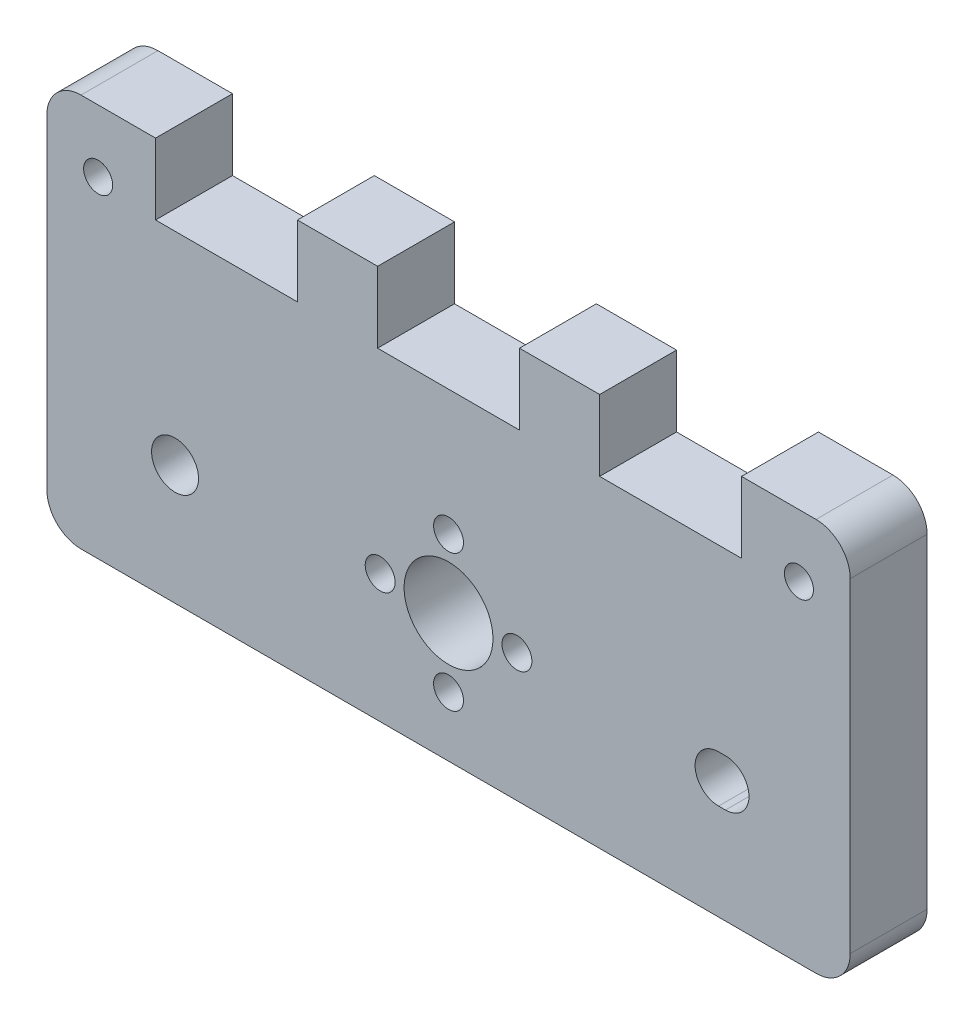
ISO-10303-21;
HEADER;
FILE_DESCRIPTION(('STEP AP214'),'2;1');
FILE_NAME('part.step','',(''),(''),'','','');
FILE_SCHEMA(('AUTOMOTIVE_DESIGN { 1 0 10303 214 1 1 1 1 }'));
ENDSEC;
DATA;
#1=APPLICATION_CONTEXT('core data for automotive mechanical design processes');
#2=APPLICATION_PROTOCOL_DEFINITION('international standard','automotive_design',2000,#1);
#3=PRODUCT_CONTEXT('',#1,'mechanical');
#4=PRODUCT('Part','Part','',(#3));
#5=PRODUCT_RELATED_PRODUCT_CATEGORY('part','',(#4));
#6=PRODUCT_DEFINITION_FORMATION('','',#4);
#7=PRODUCT_DEFINITION_CONTEXT('part definition',#1,'design');
#8=PRODUCT_DEFINITION('design','',#6,#7);
#9=PRODUCT_DEFINITION_SHAPE('','',#8);
#10=(LENGTH_UNIT() NAMED_UNIT(*) SI_UNIT(.MILLI.,.METRE.));
#11=(NAMED_UNIT(*) PLANE_ANGLE_UNIT() SI_UNIT($,.RADIAN.));
#12=(NAMED_UNIT(*) SI_UNIT($,.STERADIAN.) SOLID_ANGLE_UNIT());
#13=UNCERTAINTY_MEASURE_WITH_UNIT(LENGTH_MEASURE(1.E-05),#10,'distance_accuracy_value','');
#14=(GEOMETRIC_REPRESENTATION_CONTEXT(3) GLOBAL_UNCERTAINTY_ASSIGNED_CONTEXT((#13)) GLOBAL_UNIT_ASSIGNED_CONTEXT((#10,
#11,#12)) REPRESENTATION_CONTEXT('',''));
#15=CARTESIAN_POINT('',(0.,0.,0.));
#16=DIRECTION('',(0.,0.,1.));
#17=DIRECTION('',(1.,0.,0.));
#18=AXIS2_PLACEMENT_3D('',#15,#16,#17);
#19=CARTESIAN_POINT('',(-43.,-93.,9.));
#20=DIRECTION('',(0.,0.,1.));
#21=DIRECTION('',(1.,0.,0.));
#22=AXIS2_PLACEMENT_3D('',#19,#20,#21);
#23=PLANE('',#22);
#24=CARTESIAN_POINT('',(8.,-82.,9.));
#25=DIRECTION('',(0.,0.,1.));
#26=DIRECTION('',(1.,0.,0.));
#27=AXIS2_PLACEMENT_3D('',#24,#25,#26);
#28=CIRCLE('',#27,1.75);
#29=CARTESIAN_POINT('',(9.75,-82.,9.));
#30=VERTEX_POINT('',#29);
#31=EDGE_CURVE('E383',#30,#30,#28,.T.);
#32=ORIENTED_EDGE('',*,*,#31,.F.);
#33=EDGE_LOOP('',(#32));
#34=FACE_BOUND('',#33,.T.);
#35=CARTESIAN_POINT('',(-8.,-82.0000000000004,9.));
#36=DIRECTION('',(0.,0.,1.));
#37=DIRECTION('',(1.,0.,0.));
#38=AXIS2_PLACEMENT_3D('',#35,#36,#37);
#39=CIRCLE('',#38,1.75028583979217);
#40=CARTESIAN_POINT('',(-6.24971416020783,-82.0000000000004,9.));
#41=VERTEX_POINT('',#40);
#42=EDGE_CURVE('E782',#41,#41,#39,.T.);
#43=ORIENTED_EDGE('',*,*,#42,.F.);
#44=EDGE_LOOP('',(#43));
#45=FACE_BOUND('',#44,.T.);
#46=CARTESIAN_POINT('',(-2.27373675443232E-13,-74.0000000000002,9.));
#47=DIRECTION('',(0.,0.,1.));
#48=DIRECTION('',(1.,0.,0.));
#49=AXIS2_PLACEMENT_3D('',#46,#47,#48);
#50=CIRCLE('',#49,1.75000000000036);
#51=CARTESIAN_POINT('',(1.75000000000014,-74.0000000000002,9.));
#52=VERTEX_POINT('',#51);
#53=EDGE_CURVE('E781',#52,#52,#50,.T.);
#54=ORIENTED_EDGE('',*,*,#53,.F.);
#55=EDGE_LOOP('',(#54));
#56=FACE_BOUND('',#55,.T.);
#57=CARTESIAN_POINT('',(2.26393958003914E-13,-90.0000000000002,9.));
#58=DIRECTION('',(0.,0.,1.));
#59=DIRECTION('',(1.,0.,0.));
#60=AXIS2_PLACEMENT_3D('',#57,#58,#59);
#61=CIRCLE('',#60,1.75000000000017);
#62=CARTESIAN_POINT('',(1.75000000000039,-90.0000000000002,9.));
#63=VERTEX_POINT('',#62);
#64=EDGE_CURVE('E399',#63,#63,#61,.T.);
#65=ORIENTED_EDGE('',*,*,#64,.F.);
#66=EDGE_LOOP('',(#65));
#67=FACE_BOUND('',#66,.T.);
#68=CARTESIAN_POINT('',(0.,-82.,9.));
#69=DIRECTION('',(0.,0.,1.));
#70=DIRECTION('',(1.,0.,0.));
#71=AXIS2_PLACEMENT_3D('',#68,#69,#70);
#72=CIRCLE('',#71,5.2);
#73=CARTESIAN_POINT('',(5.2,-82.,9.));
#74=VERTEX_POINT('',#73);
#75=EDGE_CURVE('E379',#74,#74,#72,.T.);
#76=ORIENTED_EDGE('',*,*,#75,.F.);
#77=EDGE_LOOP('',(#76));
#78=FACE_BOUND('',#77,.T.);
#79=CARTESIAN_POINT('',(-41.,-58.3,9.));
#80=DIRECTION('',(0.,0.,1.));
#81=DIRECTION('',(1.,0.,0.));
#82=AXIS2_PLACEMENT_3D('',#79,#80,#81);
#83=CIRCLE('',#82,1.7);
#84=CARTESIAN_POINT('',(-39.3,-58.3,9.));
#85=VERTEX_POINT('',#84);
#86=EDGE_CURVE('E380',#85,#85,#83,.F.);
#87=ORIENTED_EDGE('',*,*,#86,.T.);
#88=EDGE_LOOP('',(#87));
#89=FACE_BOUND('',#88,.T.);
#90=CARTESIAN_POINT('',(41.,-58.3,9.));
#91=DIRECTION('',(0.,0.,1.));
#92=DIRECTION('',(1.,0.,0.));
#93=AXIS2_PLACEMENT_3D('',#90,#91,#92);
#94=CIRCLE('',#93,1.7);
#95=CARTESIAN_POINT('',(42.7,-58.3,9.));
#96=VERTEX_POINT('',#95);
#97=EDGE_CURVE('E375',#96,#96,#94,.F.);
#98=ORIENTED_EDGE('',*,*,#97,.T.);
#99=EDGE_LOOP('',(#98));
#100=FACE_BOUND('',#99,.T.);
#101=DIRECTION('',(-1.,0.,0.));
#102=VECTOR('',#101,1.);
#103=CARTESIAN_POINT('',(-43.,-85.75,9.));
#104=LINE('',#103,#102);
#105=CARTESIAN_POINT('',(32.4,-85.75,9.));
#106=VERTEX_POINT('',#105);
#107=CARTESIAN_POINT('',(31.6,-85.75,9.));
#108=VERTEX_POINT('',#107);
#109=EDGE_CURVE('E269',#106,#108,#104,.T.);
#110=ORIENTED_EDGE('',*,*,#109,.T.);
#111=CARTESIAN_POINT('',(31.6,-83.,9.));
#112=DIRECTION('',(0.,0.,1.));
#113=DIRECTION('',(1.,0.,0.));
#114=AXIS2_PLACEMENT_3D('',#111,#112,#113);
#115=CIRCLE('',#114,2.75);
#116=CARTESIAN_POINT('',(31.6,-80.25,9.));
#117=VERTEX_POINT('',#116);
#118=EDGE_CURVE('E271',#108,#117,#115,.F.);
#119=ORIENTED_EDGE('',*,*,#118,.T.);
#120=DIRECTION('',(1.,0.,0.));
#121=VECTOR('',#120,1.);
#122=CARTESIAN_POINT('',(-43.,-80.25,9.));
#123=LINE('',#122,#121);
#124=CARTESIAN_POINT('',(32.4,-80.25,9.));
#125=VERTEX_POINT('',#124);
#126=EDGE_CURVE('E261',#117,#125,#123,.T.);
#127=ORIENTED_EDGE('',*,*,#126,.T.);
#128=CARTESIAN_POINT('',(32.4,-83.,9.));
#129=DIRECTION('',(0.,0.,1.));
#130=DIRECTION('',(1.,0.,0.));
#131=AXIS2_PLACEMENT_3D('',#128,#129,#130);
#132=CIRCLE('',#131,2.75);
#133=EDGE_CURVE('E270',#125,#106,#132,.F.);
#134=ORIENTED_EDGE('',*,*,#133,.T.);
#135=EDGE_LOOP('',(#110,#119,#127,#134));
#136=FACE_BOUND('',#135,.T.);
#137=CARTESIAN_POINT('',(-32.,-83.,9.));
#138=DIRECTION('',(0.,0.,1.));
#139=DIRECTION('',(1.,0.,0.));
#140=AXIS2_PLACEMENT_3D('',#137,#138,#139);
#141=CIRCLE('',#140,2.75);
#142=CARTESIAN_POINT('',(-29.25,-83.,9.));
#143=VERTEX_POINT('',#142);
#144=EDGE_CURVE('E276',#143,#143,#141,.F.);
#145=ORIENTED_EDGE('',*,*,#144,.T.);
#146=EDGE_LOOP('',(#145));
#147=FACE_BOUND('',#146,.T.);
#148=DIRECTION('',(-1.,0.,0.));
#149=VECTOR('',#148,1.);
#150=CARTESIAN_POINT('',(-43.,-59.3,9.));
#151=LINE('',#150,#149);
#152=CARTESIAN_POINT('',(-17.6807621135332,-59.3,9.));
#153=VERTEX_POINT('',#152);
#154=CARTESIAN_POINT('',(-34.2807621135332,-59.3,9.));
#155=VERTEX_POINT('',#154);
#156=EDGE_CURVE('E252',#153,#155,#151,.T.);
#157=ORIENTED_EDGE('',*,*,#156,.T.);
#158=DIRECTION('',(0.,1.,0.));
#159=VECTOR('',#158,1.);
#160=CARTESIAN_POINT('',(-34.2807621135332,-93.,9.));
#161=LINE('',#160,#159);
#162=CARTESIAN_POINT('',(-34.2807621135332,-51.,9.));
#163=VERTEX_POINT('',#162);
#164=EDGE_CURVE('E215',#155,#163,#161,.T.);
#165=ORIENTED_EDGE('',*,*,#164,.T.);
#166=DIRECTION('',(-1.,0.,0.));
#167=VECTOR('',#166,1.);
#168=CARTESIAN_POINT('',(43.,-51.,9.));
#169=LINE('',#168,#167);
#170=CARTESIAN_POINT('',(-43.,-51.,9.));
#171=VERTEX_POINT('',#170);
#172=EDGE_CURVE('E291',#163,#171,#169,.T.);
#173=ORIENTED_EDGE('',*,*,#172,.T.);
#174=CARTESIAN_POINT('',(-43.,-55.,9.));
#175=DIRECTION('',(0.,0.,1.));
#176=DIRECTION('',(1.,0.,0.));
#177=AXIS2_PLACEMENT_3D('',#174,#175,#176);
#178=CIRCLE('',#177,3.99999999999999);
#179=CARTESIAN_POINT('',(-47.,-55.,9.));
#180=VERTEX_POINT('',#179);
#181=EDGE_CURVE('E300',#171,#180,#178,.T.);
#182=ORIENTED_EDGE('',*,*,#181,.T.);
#183=DIRECTION('',(0.,-1.,0.));
#184=VECTOR('',#183,1.);
#185=CARTESIAN_POINT('',(-47.,-55.,9.));
#186=LINE('',#185,#184);
#187=CARTESIAN_POINT('',(-47.,-93.,9.));
#188=VERTEX_POINT('',#187);
#189=EDGE_CURVE('E299',#180,#188,#186,.T.);
#190=ORIENTED_EDGE('',*,*,#189,.T.);
#191=CARTESIAN_POINT('',(-43.,-93.,9.));
#192=DIRECTION('',(0.,0.,1.));
#193=DIRECTION('',(1.,0.,0.));
#194=AXIS2_PLACEMENT_3D('',#191,#192,#193);
#195=CIRCLE('',#194,3.99999999999999);
#196=CARTESIAN_POINT('',(-43.,-97.,9.));
#197=VERTEX_POINT('',#196);
#198=EDGE_CURVE('E282',#188,#197,#195,.T.);
#199=ORIENTED_EDGE('',*,*,#198,.T.);
#200=DIRECTION('',(1.,0.,0.));
#201=VECTOR('',#200,1.);
#202=CARTESIAN_POINT('',(-43.,-97.,9.));
#203=LINE('',#202,#201);
#204=CARTESIAN_POINT('',(43.,-97.,9.));
#205=VERTEX_POINT('',#204);
#206=EDGE_CURVE('E281',#197,#205,#203,.T.);
#207=ORIENTED_EDGE('',*,*,#206,.T.);
#208=CARTESIAN_POINT('',(43.,-93.,9.));
#209=DIRECTION('',(0.,0.,1.));
#210=DIRECTION('',(1.,0.,0.));
#211=AXIS2_PLACEMENT_3D('',#208,#209,#210);
#212=CIRCLE('',#211,3.99999999999999);
#213=CARTESIAN_POINT('',(47.,-93.,9.));
#214=VERTEX_POINT('',#213);
#215=EDGE_CURVE('E290',#205,#214,#212,.T.);
#216=ORIENTED_EDGE('',*,*,#215,.T.);
#217=DIRECTION('',(0.,1.,0.));
#218=VECTOR('',#217,1.);
#219=CARTESIAN_POINT('',(47.,-93.,9.));
#220=LINE('',#219,#218);
#221=CARTESIAN_POINT('',(47.,-55.,9.));
#222=VERTEX_POINT('',#221);
#223=EDGE_CURVE('E287',#214,#222,#220,.T.);
#224=ORIENTED_EDGE('',*,*,#223,.T.);
#225=CARTESIAN_POINT('',(43.,-55.,9.));
#226=DIRECTION('',(0.,0.,1.));
#227=DIRECTION('',(1.,0.,0.));
#228=AXIS2_PLACEMENT_3D('',#225,#226,#227);
#229=CIRCLE('',#228,3.99999999999999);
#230=CARTESIAN_POINT('',(43.,-51.,9.));
#231=VERTEX_POINT('',#230);
#232=EDGE_CURVE('E293',#222,#231,#229,.T.);
#233=ORIENTED_EDGE('',*,*,#232,.T.);
#234=CARTESIAN_POINT('',(34.2807621135332,-51.,9.));
#235=VERTEX_POINT('',#234);
#236=EDGE_CURVE('E295',#231,#235,#169,.T.);
#237=ORIENTED_EDGE('',*,*,#236,.T.);
#238=DIRECTION('',(0.,-1.,0.));
#239=VECTOR('',#238,1.);
#240=CARTESIAN_POINT('',(34.2807621135332,-93.,9.));
#241=LINE('',#240,#239);
#242=CARTESIAN_POINT('',(34.2807621135332,-59.3,9.));
#243=VERTEX_POINT('',#242);
#244=EDGE_CURVE('E232',#235,#243,#241,.T.);
#245=ORIENTED_EDGE('',*,*,#244,.T.);
#246=DIRECTION('',(-1.,0.,0.));
#247=VECTOR('',#246,1.);
#248=CARTESIAN_POINT('',(-43.,-59.3,9.));
#249=LINE('',#248,#247);
#250=CARTESIAN_POINT('',(17.6807621135332,-59.3,9.));
#251=VERTEX_POINT('',#250);
#252=EDGE_CURVE('E211',#243,#251,#249,.T.);
#253=ORIENTED_EDGE('',*,*,#252,.T.);
#254=DIRECTION('',(0.,1.,0.));
#255=VECTOR('',#254,1.);
#256=CARTESIAN_POINT('',(17.6807621135332,-93.,9.));
#257=LINE('',#256,#255);
#258=CARTESIAN_POINT('',(17.6807621135332,-51.,9.));
#259=VERTEX_POINT('',#258);
#260=EDGE_CURVE('E239',#251,#259,#257,.T.);
#261=ORIENTED_EDGE('',*,*,#260,.T.);
#262=CARTESIAN_POINT('',(8.3,-51.,9.));
#263=VERTEX_POINT('',#262);
#264=EDGE_CURVE('E222',#259,#263,#169,.T.);
#265=ORIENTED_EDGE('',*,*,#264,.T.);
#266=DIRECTION('',(0.,-1.,0.));
#267=VECTOR('',#266,1.);
#268=CARTESIAN_POINT('',(8.3,-93.,9.));
#269=LINE('',#268,#267);
#270=CARTESIAN_POINT('',(8.29999999999999,-59.3,9.));
#271=VERTEX_POINT('',#270);
#272=EDGE_CURVE('E63',#263,#271,#269,.T.);
#273=ORIENTED_EDGE('',*,*,#272,.T.);
#274=DIRECTION('',(-1.,0.,0.));
#275=VECTOR('',#274,1.);
#276=CARTESIAN_POINT('',(-43.,-59.3,9.));
#277=LINE('',#276,#275);
#278=CARTESIAN_POINT('',(-8.30000000000001,-59.3,9.));
#279=VERTEX_POINT('',#278);
#280=EDGE_CURVE('E202',#271,#279,#277,.T.);
#281=ORIENTED_EDGE('',*,*,#280,.T.);
#282=DIRECTION('',(0.,1.,0.));
#283=VECTOR('',#282,1.);
#284=CARTESIAN_POINT('',(-8.30000000000001,-93.,9.));
#285=LINE('',#284,#283);
#286=CARTESIAN_POINT('',(-8.30000000000001,-51.,9.));
#287=VERTEX_POINT('',#286);
#288=EDGE_CURVE('E227',#279,#287,#285,.T.);
#289=ORIENTED_EDGE('',*,*,#288,.T.);
#290=CARTESIAN_POINT('',(-17.6807621135332,-51.,9.));
#291=VERTEX_POINT('',#290);
#292=EDGE_CURVE('E454',#287,#291,#169,.T.);
#293=ORIENTED_EDGE('',*,*,#292,.T.);
#294=DIRECTION('',(0.,-1.,0.));
#295=VECTOR('',#294,1.);
#296=CARTESIAN_POINT('',(-17.6807621135332,-93.,9.));
#297=LINE('',#296,#295);
#298=EDGE_CURVE('E57',#291,#153,#297,.T.);
#299=ORIENTED_EDGE('',*,*,#298,.T.);
#300=EDGE_LOOP('',(#157,#165,#173,#182,#190,#199,#207,#216,#224,#233,#237,#245,#253,#261,#265,
#273,#281,#289,#293,#299));
#301=FACE_BOUND('',#300,.T.);
#302=ADVANCED_FACE('F39',(#34,#45,#56,#67,#78,#89,#100,#136,#147,#301),#23,.T.);
#303=CARTESIAN_POINT('',(-43.,-93.,0.));
#304=DIRECTION('',(0.,0.,1.));
#305=DIRECTION('',(1.,0.,0.));
#306=AXIS2_PLACEMENT_3D('',#303,#304,#305);
#307=PLANE('',#306);
#308=CARTESIAN_POINT('',(8.,-82.,0.));
#309=DIRECTION('',(0.,0.,1.));
#310=DIRECTION('',(1.,0.,0.));
#311=AXIS2_PLACEMENT_3D('',#308,#309,#310);
#312=CIRCLE('',#311,1.75);
#313=CARTESIAN_POINT('',(9.75,-82.,0.));
#314=VERTEX_POINT('',#313);
#315=EDGE_CURVE('E43',#314,#314,#312,.T.);
#316=ORIENTED_EDGE('',*,*,#315,.T.);
#317=EDGE_LOOP('',(#316));
#318=FACE_BOUND('',#317,.T.);
#319=CARTESIAN_POINT('',(-8.,-82.0000000000004,0.));
#320=DIRECTION('',(0.,0.,1.));
#321=DIRECTION('',(1.,0.,0.));
#322=AXIS2_PLACEMENT_3D('',#319,#320,#321);
#323=CIRCLE('',#322,1.75028583979217);
#324=CARTESIAN_POINT('',(-6.24971416020783,-82.0000000000004,0.));
#325=VERTEX_POINT('',#324);
#326=EDGE_CURVE('E386',#325,#325,#323,.T.);
#327=ORIENTED_EDGE('',*,*,#326,.T.);
#328=EDGE_LOOP('',(#327));
#329=FACE_BOUND('',#328,.T.);
#330=CARTESIAN_POINT('',(-2.27373675443232E-13,-74.0000000000002,0.));
#331=DIRECTION('',(0.,0.,1.));
#332=DIRECTION('',(1.,0.,0.));
#333=AXIS2_PLACEMENT_3D('',#330,#331,#332);
#334=CIRCLE('',#333,1.75000000000036);
#335=CARTESIAN_POINT('',(1.75000000000014,-74.0000000000002,0.));
#336=VERTEX_POINT('',#335);
#337=EDGE_CURVE('E381',#336,#336,#334,.T.);
#338=ORIENTED_EDGE('',*,*,#337,.T.);
#339=EDGE_LOOP('',(#338));
#340=FACE_BOUND('',#339,.T.);
#341=CARTESIAN_POINT('',(2.26393958003914E-13,-90.0000000000002,0.));
#342=DIRECTION('',(0.,0.,1.));
#343=DIRECTION('',(1.,0.,0.));
#344=AXIS2_PLACEMENT_3D('',#341,#342,#343);
#345=CIRCLE('',#344,1.75000000000017);
#346=CARTESIAN_POINT('',(1.75000000000039,-90.0000000000002,0.));
#347=VERTEX_POINT('',#346);
#348=EDGE_CURVE('E382',#347,#347,#345,.T.);
#349=ORIENTED_EDGE('',*,*,#348,.T.);
#350=EDGE_LOOP('',(#349));
#351=FACE_BOUND('',#350,.T.);
#352=CARTESIAN_POINT('',(0.,-82.,0.));
#353=DIRECTION('',(0.,0.,1.));
#354=DIRECTION('',(1.,0.,0.));
#355=AXIS2_PLACEMENT_3D('',#352,#353,#354);
#356=CIRCLE('',#355,5.2);
#357=CARTESIAN_POINT('',(5.2,-82.,0.));
#358=VERTEX_POINT('',#357);
#359=EDGE_CURVE('E373',#358,#358,#356,.F.);
#360=ORIENTED_EDGE('',*,*,#359,.F.);
#361=EDGE_LOOP('',(#360));
#362=FACE_BOUND('',#361,.T.);
#363=CARTESIAN_POINT('',(-41.,-58.3,0.));
#364=DIRECTION('',(0.,0.,1.));
#365=DIRECTION('',(1.,0.,0.));
#366=AXIS2_PLACEMENT_3D('',#363,#364,#365);
#367=CIRCLE('',#366,1.7);
#368=CARTESIAN_POINT('',(-39.3,-58.3,0.));
#369=VERTEX_POINT('',#368);
#370=EDGE_CURVE('E372',#369,#369,#367,.F.);
#371=ORIENTED_EDGE('',*,*,#370,.F.);
#372=EDGE_LOOP('',(#371));
#373=FACE_BOUND('',#372,.T.);
#374=CARTESIAN_POINT('',(41.,-58.3,0.));
#375=DIRECTION('',(0.,0.,1.));
#376=DIRECTION('',(1.,0.,0.));
#377=AXIS2_PLACEMENT_3D('',#374,#375,#376);
#378=CIRCLE('',#377,1.7);
#379=CARTESIAN_POINT('',(42.7,-58.3,0.));
#380=VERTEX_POINT('',#379);
#381=EDGE_CURVE('E367',#380,#380,#378,.F.);
#382=ORIENTED_EDGE('',*,*,#381,.F.);
#383=EDGE_LOOP('',(#382));
#384=FACE_BOUND('',#383,.T.);
#385=CARTESIAN_POINT('',(-32.,-83.,0.));
#386=DIRECTION('',(0.,0.,1.));
#387=DIRECTION('',(1.,0.,0.));
#388=AXIS2_PLACEMENT_3D('',#385,#386,#387);
#389=CIRCLE('',#388,2.75);
#390=CARTESIAN_POINT('',(-29.25,-83.,0.));
#391=VERTEX_POINT('',#390);
#392=EDGE_CURVE('E279',#391,#391,#389,.F.);
#393=ORIENTED_EDGE('',*,*,#392,.F.);
#394=EDGE_LOOP('',(#393));
#395=FACE_BOUND('',#394,.T.);
#396=CARTESIAN_POINT('',(31.6,-83.,0.));
#397=DIRECTION('',(0.,0.,1.));
#398=DIRECTION('',(1.,0.,0.));
#399=AXIS2_PLACEMENT_3D('',#396,#397,#398);
#400=CIRCLE('',#399,2.75);
#401=CARTESIAN_POINT('',(31.6,-85.75,0.));
#402=VERTEX_POINT('',#401);
#403=CARTESIAN_POINT('',(31.6,-80.25,0.));
#404=VERTEX_POINT('',#403);
#405=EDGE_CURVE('E346',#402,#404,#400,.F.);
#406=ORIENTED_EDGE('',*,*,#405,.F.);
#407=DIRECTION('',(-1.,0.,0.));
#408=VECTOR('',#407,1.);
#409=CARTESIAN_POINT('',(-43.,-85.75,0.));
#410=LINE('',#409,#408);
#411=CARTESIAN_POINT('',(32.4,-85.75,0.));
#412=VERTEX_POINT('',#411);
#413=EDGE_CURVE('E349',#412,#402,#410,.T.);
#414=ORIENTED_EDGE('',*,*,#413,.F.);
#415=CARTESIAN_POINT('',(32.4,-83.,0.));
#416=DIRECTION('',(0.,0.,1.));
#417=DIRECTION('',(1.,0.,0.));
#418=AXIS2_PLACEMENT_3D('',#415,#416,#417);
#419=CIRCLE('',#418,2.75);
#420=CARTESIAN_POINT('',(32.4,-80.25,0.));
#421=VERTEX_POINT('',#420);
#422=EDGE_CURVE('E342',#421,#412,#419,.F.);
#423=ORIENTED_EDGE('',*,*,#422,.F.);
#424=DIRECTION('',(1.,0.,0.));
#425=VECTOR('',#424,1.);
#426=CARTESIAN_POINT('',(-43.,-80.25,0.));
#427=LINE('',#426,#425);
#428=EDGE_CURVE('E345',#404,#421,#427,.T.);
#429=ORIENTED_EDGE('',*,*,#428,.F.);
#430=EDGE_LOOP('',(#406,#414,#423,#429));
#431=FACE_BOUND('',#430,.T.);
#432=DIRECTION('',(0.,1.,0.));
#433=VECTOR('',#432,1.);
#434=CARTESIAN_POINT('',(-34.2807621135332,-93.,0.));
#435=LINE('',#434,#433);
#436=CARTESIAN_POINT('',(-34.2807621135332,-59.3,0.));
#437=VERTEX_POINT('',#436);
#438=CARTESIAN_POINT('',(-34.2807621135332,-51.,0.));
#439=VERTEX_POINT('',#438);
#440=EDGE_CURVE('E244',#437,#439,#435,.T.);
#441=ORIENTED_EDGE('',*,*,#440,.F.);
#442=DIRECTION('',(-1.,0.,0.));
#443=VECTOR('',#442,1.);
#444=CARTESIAN_POINT('',(-43.,-59.3,0.));
#445=LINE('',#444,#443);
#446=CARTESIAN_POINT('',(-17.6807621135332,-59.3,0.));
#447=VERTEX_POINT('',#446);
#448=EDGE_CURVE('E11',#447,#437,#445,.T.);
#449=ORIENTED_EDGE('',*,*,#448,.F.);
#450=DIRECTION('',(0.,-1.,0.));
#451=VECTOR('',#450,1.);
#452=CARTESIAN_POINT('',(-17.6807621135332,-93.,0.));
#453=LINE('',#452,#451);
#454=CARTESIAN_POINT('',(-17.6807621135332,-51.,0.));
#455=VERTEX_POINT('',#454);
#456=EDGE_CURVE('E245',#455,#447,#453,.T.);
#457=ORIENTED_EDGE('',*,*,#456,.F.);
#458=DIRECTION('',(-1.,0.,0.));
#459=VECTOR('',#458,1.);
#460=CARTESIAN_POINT('',(43.,-51.,0.));
#461=LINE('',#460,#459);
#462=CARTESIAN_POINT('',(-8.30000000000001,-51.,0.));
#463=VERTEX_POINT('',#462);
#464=EDGE_CURVE('E428',#463,#455,#461,.T.);
#465=ORIENTED_EDGE('',*,*,#464,.F.);
#466=DIRECTION('',(0.,1.,0.));
#467=VECTOR('',#466,1.);
#468=CARTESIAN_POINT('',(-8.30000000000001,-93.,0.));
#469=LINE('',#468,#467);
#470=CARTESIAN_POINT('',(-8.30000000000001,-59.3,0.));
#471=VERTEX_POINT('',#470);
#472=EDGE_CURVE('E224',#471,#463,#469,.T.);
#473=ORIENTED_EDGE('',*,*,#472,.F.);
#474=DIRECTION('',(-1.,0.,0.));
#475=VECTOR('',#474,1.);
#476=CARTESIAN_POINT('',(-43.,-59.3,0.));
#477=LINE('',#476,#475);
#478=CARTESIAN_POINT('',(8.29999999999999,-59.3,0.));
#479=VERTEX_POINT('',#478);
#480=EDGE_CURVE('E366',#479,#471,#477,.T.);
#481=ORIENTED_EDGE('',*,*,#480,.F.);
#482=DIRECTION('',(0.,-1.,0.));
#483=VECTOR('',#482,1.);
#484=CARTESIAN_POINT('',(8.3,-93.,0.));
#485=LINE('',#484,#483);
#486=CARTESIAN_POINT('',(8.3,-51.,0.));
#487=VERTEX_POINT('',#486);
#488=EDGE_CURVE('E219',#487,#479,#485,.T.);
#489=ORIENTED_EDGE('',*,*,#488,.F.);
#490=CARTESIAN_POINT('',(17.6807621135332,-51.,0.));
#491=VERTEX_POINT('',#490);
#492=EDGE_CURVE('E320',#491,#487,#461,.T.);
#493=ORIENTED_EDGE('',*,*,#492,.F.);
#494=DIRECTION('',(0.,1.,0.));
#495=VECTOR('',#494,1.);
#496=CARTESIAN_POINT('',(17.6807621135332,-93.,0.));
#497=LINE('',#496,#495);
#498=CARTESIAN_POINT('',(17.6807621135332,-59.3,0.));
#499=VERTEX_POINT('',#498);
#500=EDGE_CURVE('E238',#499,#491,#497,.T.);
#501=ORIENTED_EDGE('',*,*,#500,.F.);
#502=DIRECTION('',(-1.,0.,0.));
#503=VECTOR('',#502,1.);
#504=CARTESIAN_POINT('',(-43.,-59.3,0.));
#505=LINE('',#504,#503);
#506=CARTESIAN_POINT('',(34.2807621135332,-59.3,0.));
#507=VERTEX_POINT('',#506);
#508=EDGE_CURVE('E48',#507,#499,#505,.T.);
#509=ORIENTED_EDGE('',*,*,#508,.F.);
#510=DIRECTION('',(0.,-1.,0.));
#511=VECTOR('',#510,1.);
#512=CARTESIAN_POINT('',(34.2807621135332,-93.,0.));
#513=LINE('',#512,#511);
#514=CARTESIAN_POINT('',(34.2807621135332,-51.,0.));
#515=VERTEX_POINT('',#514);
#516=EDGE_CURVE('E231',#515,#507,#513,.T.);
#517=ORIENTED_EDGE('',*,*,#516,.F.);
#518=CARTESIAN_POINT('',(43.,-51.,0.));
#519=VERTEX_POINT('',#518);
#520=EDGE_CURVE('E312',#519,#515,#461,.T.);
#521=ORIENTED_EDGE('',*,*,#520,.F.);
#522=CARTESIAN_POINT('',(43.,-55.,0.));
#523=DIRECTION('',(0.,0.,1.));
#524=DIRECTION('',(1.,0.,0.));
#525=AXIS2_PLACEMENT_3D('',#522,#523,#524);
#526=CIRCLE('',#525,3.99999999999999);
#527=CARTESIAN_POINT('',(47.,-55.,0.));
#528=VERTEX_POINT('',#527);
#529=EDGE_CURVE('E309',#528,#519,#526,.T.);
#530=ORIENTED_EDGE('',*,*,#529,.F.);
#531=DIRECTION('',(0.,1.,0.));
#532=VECTOR('',#531,1.);
#533=CARTESIAN_POINT('',(47.,-93.,0.));
#534=LINE('',#533,#532);
#535=CARTESIAN_POINT('',(47.,-93.,0.));
#536=VERTEX_POINT('',#535);
#537=EDGE_CURVE('E308',#536,#528,#534,.T.);
#538=ORIENTED_EDGE('',*,*,#537,.F.);
#539=CARTESIAN_POINT('',(43.,-93.,0.));
#540=DIRECTION('',(0.,0.,1.));
#541=DIRECTION('',(1.,0.,0.));
#542=AXIS2_PLACEMENT_3D('',#539,#540,#541);
#543=CIRCLE('',#542,3.99999999999999);
#544=CARTESIAN_POINT('',(43.,-97.,0.));
#545=VERTEX_POINT('',#544);
#546=EDGE_CURVE('E306',#545,#536,#543,.T.);
#547=ORIENTED_EDGE('',*,*,#546,.F.);
#548=DIRECTION('',(1.,0.,0.));
#549=VECTOR('',#548,1.);
#550=CARTESIAN_POINT('',(-43.,-97.,0.));
#551=LINE('',#550,#549);
#552=CARTESIAN_POINT('',(-43.,-97.,0.));
#553=VERTEX_POINT('',#552);
#554=EDGE_CURVE('E302',#553,#545,#551,.T.);
#555=ORIENTED_EDGE('',*,*,#554,.F.);
#556=CARTESIAN_POINT('',(-43.,-93.,0.));
#557=DIRECTION('',(0.,0.,1.));
#558=DIRECTION('',(1.,0.,0.));
#559=AXIS2_PLACEMENT_3D('',#556,#557,#558);
#560=CIRCLE('',#559,3.99999999999999);
#561=CARTESIAN_POINT('',(-47.,-93.,0.));
#562=VERTEX_POINT('',#561);
#563=EDGE_CURVE('E277',#562,#553,#560,.T.);
#564=ORIENTED_EDGE('',*,*,#563,.F.);
#565=DIRECTION('',(0.,-1.,0.));
#566=VECTOR('',#565,1.);
#567=CARTESIAN_POINT('',(-47.,-55.,0.));
#568=LINE('',#567,#566);
#569=CARTESIAN_POINT('',(-47.,-55.,0.));
#570=VERTEX_POINT('',#569);
#571=EDGE_CURVE('E283',#570,#562,#568,.T.);
#572=ORIENTED_EDGE('',*,*,#571,.F.);
#573=CARTESIAN_POINT('',(-43.,-55.,0.));
#574=DIRECTION('',(0.,0.,1.));
#575=DIRECTION('',(1.,0.,0.));
#576=AXIS2_PLACEMENT_3D('',#573,#574,#575);
#577=CIRCLE('',#576,3.99999999999999);
#578=CARTESIAN_POINT('',(-43.,-51.,0.));
#579=VERTEX_POINT('',#578);
#580=EDGE_CURVE('E317',#579,#570,#577,.T.);
#581=ORIENTED_EDGE('',*,*,#580,.F.);
#582=EDGE_CURVE('E315',#439,#579,#461,.T.);
#583=ORIENTED_EDGE('',*,*,#582,.F.);
#584=EDGE_LOOP('',(#441,#449,#457,#465,#473,#481,#489,#493,#501,#509,#517,#521,#530,#538,#547,
#555,#564,#572,#581,#583));
#585=FACE_BOUND('',#584,.T.);
#586=ADVANCED_FACE('F421',(#318,#329,#340,#351,#362,#373,#384,#395,#431,#585),#307,.F.);
#587=CARTESIAN_POINT('',(43.,-51.,9.));
#588=DIRECTION('',(0.,-1.,0.));
#589=DIRECTION('',(0.,0.,-1.));
#590=AXIS2_PLACEMENT_3D('',#587,#588,#589);
#591=PLANE('',#590);
#592=DIRECTION('',(0.,0.,1.));
#593=VECTOR('',#592,1.);
#594=CARTESIAN_POINT('',(-34.2807621135332,-51.,9.));
#595=LINE('',#594,#593);
#596=EDGE_CURVE('E364',#439,#163,#595,.T.);
#597=ORIENTED_EDGE('',*,*,#596,.F.);
#598=ORIENTED_EDGE('',*,*,#582,.T.);
#599=DIRECTION('',(0.,0.,-1.));
#600=VECTOR('',#599,1.);
#601=CARTESIAN_POINT('',(-43.,-51.,9.));
#602=LINE('',#601,#600);
#603=EDGE_CURVE('E322',#171,#579,#602,.T.);
#604=ORIENTED_EDGE('',*,*,#603,.F.);
#605=ORIENTED_EDGE('',*,*,#172,.F.);
#606=EDGE_LOOP('',(#597,#598,#604,#605));
#607=FACE_BOUND('',#606,.T.);
#608=ADVANCED_FACE('F432',(#607),#591,.F.);
#609=DIRECTION('',(0.,0.,-1.));
#610=VECTOR('',#609,1.);
#611=CARTESIAN_POINT('',(-17.6807621135332,-51.,9.));
#612=LINE('',#611,#610);
#613=EDGE_CURVE('E365',#291,#455,#612,.T.);
#614=ORIENTED_EDGE('',*,*,#613,.F.);
#615=ORIENTED_EDGE('',*,*,#292,.F.);
#616=DIRECTION('',(0.,0.,1.));
#617=VECTOR('',#616,1.);
#618=CARTESIAN_POINT('',(-8.30000000000001,-51.,9.));
#619=LINE('',#618,#617);
#620=EDGE_CURVE('E358',#463,#287,#619,.T.);
#621=ORIENTED_EDGE('',*,*,#620,.F.);
#622=ORIENTED_EDGE('',*,*,#464,.T.);
#623=EDGE_LOOP('',(#614,#615,#621,#622));
#624=FACE_BOUND('',#623,.T.);
#625=ADVANCED_FACE('F453',(#624),#591,.F.);
#626=DIRECTION('',(0.,0.,1.));
#627=VECTOR('',#626,1.);
#628=CARTESIAN_POINT('',(17.6807621135332,-51.,9.));
#629=LINE('',#628,#627);
#630=EDGE_CURVE('E359',#491,#259,#629,.T.);
#631=ORIENTED_EDGE('',*,*,#630,.F.);
#632=ORIENTED_EDGE('',*,*,#492,.T.);
#633=DIRECTION('',(0.,0.,-1.));
#634=VECTOR('',#633,1.);
#635=CARTESIAN_POINT('',(8.3,-51.,9.));
#636=LINE('',#635,#634);
#637=EDGE_CURVE('E355',#263,#487,#636,.T.);
#638=ORIENTED_EDGE('',*,*,#637,.F.);
#639=ORIENTED_EDGE('',*,*,#264,.F.);
#640=EDGE_LOOP('',(#631,#632,#638,#639));
#641=FACE_BOUND('',#640,.T.);
#642=ADVANCED_FACE('F536',(#641),#591,.F.);
#643=DIRECTION('',(0.,0.,-1.));
#644=VECTOR('',#643,1.);
#645=CARTESIAN_POINT('',(34.2807621135332,-51.,9.));
#646=LINE('',#645,#644);
#647=EDGE_CURVE('E356',#235,#515,#646,.T.);
#648=ORIENTED_EDGE('',*,*,#647,.F.);
#649=ORIENTED_EDGE('',*,*,#236,.F.);
#650=DIRECTION('',(0.,0.,-1.));
#651=VECTOR('',#650,1.);
#652=CARTESIAN_POINT('',(43.,-51.,9.));
#653=LINE('',#652,#651);
#654=EDGE_CURVE('E330',#231,#519,#653,.T.);
#655=ORIENTED_EDGE('',*,*,#654,.T.);
#656=ORIENTED_EDGE('',*,*,#520,.T.);
#657=EDGE_LOOP('',(#648,#649,#655,#656));
#658=FACE_BOUND('',#657,.T.);
#659=ADVANCED_FACE('F494',(#658),#591,.F.);
#660=CARTESIAN_POINT('',(-43.,-93.,9.));
#661=DIRECTION('',(0.,0.,-1.));
#662=DIRECTION('',(-1.,0.,0.));
#663=AXIS2_PLACEMENT_3D('',#660,#661,#662);
#664=CYLINDRICAL_SURFACE('',#663,3.99999999999999);
#665=ORIENTED_EDGE('',*,*,#563,.T.);
#666=DIRECTION('',(0.,0.,-1.));
#667=VECTOR('',#666,1.);
#668=CARTESIAN_POINT('',(-43.,-97.,9.));
#669=LINE('',#668,#667);
#670=EDGE_CURVE('E338',#197,#553,#669,.T.);
#671=ORIENTED_EDGE('',*,*,#670,.F.);
#672=ORIENTED_EDGE('',*,*,#198,.F.);
#673=DIRECTION('',(0.,0.,-1.));
#674=VECTOR('',#673,1.);
#675=CARTESIAN_POINT('',(-47.,-93.,9.));
#676=LINE('',#675,#674);
#677=EDGE_CURVE('E301',#188,#562,#676,.T.);
#678=ORIENTED_EDGE('',*,*,#677,.T.);
#679=EDGE_LOOP('',(#665,#671,#672,#678));
#680=FACE_BOUND('',#679,.T.);
#681=ADVANCED_FACE('F41',(#680),#664,.T.);
#682=CARTESIAN_POINT('',(-43.,-97.,9.));
#683=DIRECTION('',(0.,1.,0.));
#684=DIRECTION('',(0.,0.,1.));
#685=AXIS2_PLACEMENT_3D('',#682,#683,#684);
#686=PLANE('',#685);
#687=ORIENTED_EDGE('',*,*,#554,.T.);
#688=DIRECTION('',(0.,0.,-1.));
#689=VECTOR('',#688,1.);
#690=CARTESIAN_POINT('',(43.,-97.,9.));
#691=LINE('',#690,#689);
#692=EDGE_CURVE('E340',#205,#545,#691,.T.);
#693=ORIENTED_EDGE('',*,*,#692,.F.);
#694=ORIENTED_EDGE('',*,*,#206,.F.);
#695=ORIENTED_EDGE('',*,*,#670,.T.);
#696=EDGE_LOOP('',(#687,#693,#694,#695));
#697=FACE_BOUND('',#696,.T.);
#698=ADVANCED_FACE('F502',(#697),#686,.F.);
#699=CARTESIAN_POINT('',(43.,-93.,9.));
#700=DIRECTION('',(0.,0.,-1.));
#701=DIRECTION('',(-1.,0.,0.));
#702=AXIS2_PLACEMENT_3D('',#699,#700,#701);
#703=CYLINDRICAL_SURFACE('',#702,3.99999999999999);
#704=ORIENTED_EDGE('',*,*,#546,.T.);
#705=DIRECTION('',(0.,0.,-1.));
#706=VECTOR('',#705,1.);
#707=CARTESIAN_POINT('',(47.,-93.,9.));
#708=LINE('',#707,#706);
#709=EDGE_CURVE('E332',#214,#536,#708,.T.);
#710=ORIENTED_EDGE('',*,*,#709,.F.);
#711=ORIENTED_EDGE('',*,*,#215,.F.);
#712=ORIENTED_EDGE('',*,*,#692,.T.);
#713=EDGE_LOOP('',(#704,#710,#711,#712));
#714=FACE_BOUND('',#713,.T.);
#715=ADVANCED_FACE('F501',(#714),#703,.T.);
#716=CARTESIAN_POINT('',(47.,-93.,9.));
#717=DIRECTION('',(-1.,0.,0.));
#718=DIRECTION('',(0.,-1.,0.));
#719=AXIS2_PLACEMENT_3D('',#716,#717,#718);
#720=PLANE('',#719);
#721=ORIENTED_EDGE('',*,*,#537,.T.);
#722=DIRECTION('',(0.,0.,-1.));
#723=VECTOR('',#722,1.);
#724=CARTESIAN_POINT('',(47.,-55.,9.));
#725=LINE('',#724,#723);
#726=EDGE_CURVE('E333',#222,#528,#725,.T.);
#727=ORIENTED_EDGE('',*,*,#726,.F.);
#728=ORIENTED_EDGE('',*,*,#223,.F.);
#729=ORIENTED_EDGE('',*,*,#709,.T.);
#730=EDGE_LOOP('',(#721,#727,#728,#729));
#731=FACE_BOUND('',#730,.T.);
#732=ADVANCED_FACE('F500',(#731),#720,.F.);
#733=CARTESIAN_POINT('',(43.,-55.,9.));
#734=DIRECTION('',(0.,0.,-1.));
#735=DIRECTION('',(-1.,0.,0.));
#736=AXIS2_PLACEMENT_3D('',#733,#734,#735);
#737=CYLINDRICAL_SURFACE('',#736,3.99999999999999);
#738=ORIENTED_EDGE('',*,*,#529,.T.);
#739=ORIENTED_EDGE('',*,*,#654,.F.);
#740=ORIENTED_EDGE('',*,*,#232,.F.);
#741=ORIENTED_EDGE('',*,*,#726,.T.);
#742=EDGE_LOOP('',(#738,#739,#740,#741));
#743=FACE_BOUND('',#742,.T.);
#744=ADVANCED_FACE('F493',(#743),#737,.T.);
#745=CARTESIAN_POINT('',(-43.,-55.,9.));
#746=DIRECTION('',(0.,0.,-1.));
#747=DIRECTION('',(-1.,0.,0.));
#748=AXIS2_PLACEMENT_3D('',#745,#746,#747);
#749=CYLINDRICAL_SURFACE('',#748,3.99999999999999);
#750=ORIENTED_EDGE('',*,*,#580,.T.);
#751=DIRECTION('',(0.,0.,-1.));
#752=VECTOR('',#751,1.);
#753=CARTESIAN_POINT('',(-47.,-55.,9.));
#754=LINE('',#753,#752);
#755=EDGE_CURVE('E321',#180,#570,#754,.T.);
#756=ORIENTED_EDGE('',*,*,#755,.F.);
#757=ORIENTED_EDGE('',*,*,#181,.F.);
#758=ORIENTED_EDGE('',*,*,#603,.T.);
#759=EDGE_LOOP('',(#750,#756,#757,#758));
#760=FACE_BOUND('',#759,.T.);
#761=ADVANCED_FACE('F437',(#760),#749,.T.);
#762=CARTESIAN_POINT('',(-47.,-55.,9.));
#763=DIRECTION('',(1.,0.,0.));
#764=DIRECTION('',(0.,1.,0.));
#765=AXIS2_PLACEMENT_3D('',#762,#763,#764);
#766=PLANE('',#765);
#767=ORIENTED_EDGE('',*,*,#571,.T.);
#768=ORIENTED_EDGE('',*,*,#677,.F.);
#769=ORIENTED_EDGE('',*,*,#189,.F.);
#770=ORIENTED_EDGE('',*,*,#755,.T.);
#771=EDGE_LOOP('',(#767,#768,#769,#770));
#772=FACE_BOUND('',#771,.T.);
#773=ADVANCED_FACE('F444',(#772),#766,.F.);
#774=CARTESIAN_POINT('',(31.6,-83.,9.5));
#775=DIRECTION('',(0.,0.,-1.));
#776=DIRECTION('',(-1.,0.,0.));
#777=AXIS2_PLACEMENT_3D('',#774,#775,#776);
#778=CYLINDRICAL_SURFACE('',#777,2.75);
#779=DIRECTION('',(0.,0.,-1.));
#780=VECTOR('',#779,1.);
#781=CARTESIAN_POINT('',(31.6,-85.75,9.5));
#782=LINE('',#781,#780);
#783=EDGE_CURVE('E254',#108,#402,#782,.T.);
#784=ORIENTED_EDGE('',*,*,#783,.T.);
#785=ORIENTED_EDGE('',*,*,#405,.T.);
#786=DIRECTION('',(0.,0.,-1.));
#787=VECTOR('',#786,1.);
#788=CARTESIAN_POINT('',(31.6,-80.25,9.5));
#789=LINE('',#788,#787);
#790=EDGE_CURVE('E264',#117,#404,#789,.T.);
#791=ORIENTED_EDGE('',*,*,#790,.F.);
#792=ORIENTED_EDGE('',*,*,#118,.F.);
#793=EDGE_LOOP('',(#784,#785,#791,#792));
#794=FACE_BOUND('',#793,.T.);
#795=ADVANCED_FACE('F486',(#794),#778,.F.);
#796=CARTESIAN_POINT('',(32.4,-85.75,9.5));
#797=DIRECTION('',(0.,1.,0.));
#798=DIRECTION('',(0.,0.,1.));
#799=AXIS2_PLACEMENT_3D('',#796,#797,#798);
#800=PLANE('',#799);
#801=DIRECTION('',(0.,0.,-1.));
#802=VECTOR('',#801,1.);
#803=CARTESIAN_POINT('',(32.4,-85.75,9.5));
#804=LINE('',#803,#802);
#805=EDGE_CURVE('E259',#106,#412,#804,.T.);
#806=ORIENTED_EDGE('',*,*,#805,.T.);
#807=ORIENTED_EDGE('',*,*,#413,.T.);
#808=ORIENTED_EDGE('',*,*,#783,.F.);
#809=ORIENTED_EDGE('',*,*,#109,.F.);
#810=EDGE_LOOP('',(#806,#807,#808,#809));
#811=FACE_BOUND('',#810,.T.);
#812=ADVANCED_FACE('F577',(#811),#800,.T.);
#813=CARTESIAN_POINT('',(32.4,-83.,9.5));
#814=DIRECTION('',(0.,0.,-1.));
#815=DIRECTION('',(-1.,0.,0.));
#816=AXIS2_PLACEMENT_3D('',#813,#814,#815);
#817=CYLINDRICAL_SURFACE('',#816,2.75);
#818=DIRECTION('',(0.,0.,-1.));
#819=VECTOR('',#818,1.);
#820=CARTESIAN_POINT('',(32.4,-80.25,9.5));
#821=LINE('',#820,#819);
#822=EDGE_CURVE('E258',#125,#421,#821,.T.);
#823=ORIENTED_EDGE('',*,*,#822,.T.);
#824=ORIENTED_EDGE('',*,*,#422,.T.);
#825=ORIENTED_EDGE('',*,*,#805,.F.);
#826=ORIENTED_EDGE('',*,*,#133,.F.);
#827=EDGE_LOOP('',(#823,#824,#825,#826));
#828=FACE_BOUND('',#827,.T.);
#829=ADVANCED_FACE('F568',(#828),#817,.F.);
#830=CARTESIAN_POINT('',(31.6,-80.25,9.5));
#831=DIRECTION('',(0.,-1.,0.));
#832=DIRECTION('',(0.,0.,-1.));
#833=AXIS2_PLACEMENT_3D('',#830,#831,#832);
#834=PLANE('',#833);
#835=ORIENTED_EDGE('',*,*,#790,.T.);
#836=ORIENTED_EDGE('',*,*,#428,.T.);
#837=ORIENTED_EDGE('',*,*,#822,.F.);
#838=ORIENTED_EDGE('',*,*,#126,.F.);
#839=EDGE_LOOP('',(#835,#836,#837,#838));
#840=FACE_BOUND('',#839,.T.);
#841=ADVANCED_FACE('F481',(#840),#834,.T.);
#842=CARTESIAN_POINT('',(-32.,-83.,9.5));
#843=DIRECTION('',(0.,0.,-1.));
#844=DIRECTION('',(-1.,0.,0.));
#845=AXIS2_PLACEMENT_3D('',#842,#843,#844);
#846=CYLINDRICAL_SURFACE('',#845,2.75);
#847=ORIENTED_EDGE('',*,*,#144,.F.);
#848=EDGE_LOOP('',(#847));
#849=FACE_BOUND('',#848,.T.);
#850=ORIENTED_EDGE('',*,*,#392,.T.);
#851=EDGE_LOOP('',(#850));
#852=FACE_BOUND('',#851,.T.);
#853=ADVANCED_FACE('F554',(#849,#852),#846,.F.);
#854=CARTESIAN_POINT('',(-8.30000000000001,-59.3,9.5));
#855=DIRECTION('',(0.,1.,0.));
#856=DIRECTION('',(0.,0.,1.));
#857=AXIS2_PLACEMENT_3D('',#854,#855,#856);
#858=PLANE('',#857);
#859=DIRECTION('',(0.,0.,-1.));
#860=VECTOR('',#859,1.);
#861=CARTESIAN_POINT('',(8.29999999999999,-59.3,9.5));
#862=LINE('',#861,#860);
#863=EDGE_CURVE('E207',#271,#479,#862,.T.);
#864=ORIENTED_EDGE('',*,*,#863,.T.);
#865=ORIENTED_EDGE('',*,*,#480,.T.);
#866=DIRECTION('',(0.,0.,-1.));
#867=VECTOR('',#866,1.);
#868=CARTESIAN_POINT('',(-8.30000000000001,-59.3,9.5));
#869=LINE('',#868,#867);
#870=EDGE_CURVE('E209',#279,#471,#869,.T.);
#871=ORIENTED_EDGE('',*,*,#870,.F.);
#872=ORIENTED_EDGE('',*,*,#280,.F.);
#873=EDGE_LOOP('',(#864,#865,#871,#872));
#874=FACE_BOUND('',#873,.T.);
#875=ADVANCED_FACE('F204',(#874),#858,.T.);
#876=CARTESIAN_POINT('',(-8.30000000000001,-50.,9.5));
#877=DIRECTION('',(1.,0.,0.));
#878=DIRECTION('',(0.,0.,-1.));
#879=AXIS2_PLACEMENT_3D('',#876,#877,#878);
#880=PLANE('',#879);
#881=ORIENTED_EDGE('',*,*,#870,.T.);
#882=ORIENTED_EDGE('',*,*,#472,.T.);
#883=ORIENTED_EDGE('',*,*,#620,.T.);
#884=ORIENTED_EDGE('',*,*,#288,.F.);
#885=EDGE_LOOP('',(#881,#882,#883,#884));
#886=FACE_BOUND('',#885,.T.);
#887=ADVANCED_FACE('F416',(#886),#880,.T.);
#888=CARTESIAN_POINT('',(8.29999999999999,-59.3,9.5));
#889=DIRECTION('',(-1.,0.,0.));
#890=DIRECTION('',(0.,0.,1.));
#891=AXIS2_PLACEMENT_3D('',#888,#889,#890);
#892=PLANE('',#891);
#893=ORIENTED_EDGE('',*,*,#637,.T.);
#894=ORIENTED_EDGE('',*,*,#488,.T.);
#895=ORIENTED_EDGE('',*,*,#863,.F.);
#896=ORIENTED_EDGE('',*,*,#272,.F.);
#897=EDGE_LOOP('',(#893,#894,#895,#896));
#898=FACE_BOUND('',#897,.T.);
#899=ADVANCED_FACE('F212',(#898),#892,.T.);
#900=CARTESIAN_POINT('',(17.6807621135332,-59.3,9.5));
#901=DIRECTION('',(0.,1.,0.));
#902=DIRECTION('',(0.,0.,1.));
#903=AXIS2_PLACEMENT_3D('',#900,#901,#902);
#904=PLANE('',#903);
#905=DIRECTION('',(0.,0.,-1.));
#906=VECTOR('',#905,1.);
#907=CARTESIAN_POINT('',(34.2807621135332,-59.3,9.5));
#908=LINE('',#907,#906);
#909=EDGE_CURVE('E408',#243,#507,#908,.T.);
#910=ORIENTED_EDGE('',*,*,#909,.T.);
#911=ORIENTED_EDGE('',*,*,#508,.T.);
#912=DIRECTION('',(0.,0.,-1.));
#913=VECTOR('',#912,1.);
#914=CARTESIAN_POINT('',(17.6807621135332,-59.3,9.5));
#915=LINE('',#914,#913);
#916=EDGE_CURVE('E220',#251,#499,#915,.T.);
#917=ORIENTED_EDGE('',*,*,#916,.F.);
#918=ORIENTED_EDGE('',*,*,#252,.F.);
#919=EDGE_LOOP('',(#910,#911,#917,#918));
#920=FACE_BOUND('',#919,.T.);
#921=ADVANCED_FACE('F535',(#920),#904,.T.);
#922=CARTESIAN_POINT('',(17.6807621135332,-50.,9.5));
#923=DIRECTION('',(1.,0.,0.));
#924=DIRECTION('',(0.,0.,-1.));
#925=AXIS2_PLACEMENT_3D('',#922,#923,#924);
#926=PLANE('',#925);
#927=ORIENTED_EDGE('',*,*,#916,.T.);
#928=ORIENTED_EDGE('',*,*,#500,.T.);
#929=ORIENTED_EDGE('',*,*,#630,.T.);
#930=ORIENTED_EDGE('',*,*,#260,.F.);
#931=EDGE_LOOP('',(#927,#928,#929,#930));
#932=FACE_BOUND('',#931,.T.);
#933=ADVANCED_FACE('F534',(#932),#926,.T.);
#934=CARTESIAN_POINT('',(34.2807621135332,-59.3,9.5));
#935=DIRECTION('',(-1.,0.,0.));
#936=DIRECTION('',(0.,0.,1.));
#937=AXIS2_PLACEMENT_3D('',#934,#935,#936);
#938=PLANE('',#937);
#939=ORIENTED_EDGE('',*,*,#647,.T.);
#940=ORIENTED_EDGE('',*,*,#516,.T.);
#941=ORIENTED_EDGE('',*,*,#909,.F.);
#942=ORIENTED_EDGE('',*,*,#244,.F.);
#943=EDGE_LOOP('',(#939,#940,#941,#942));
#944=FACE_BOUND('',#943,.T.);
#945=ADVANCED_FACE('F469',(#944),#938,.T.);
#946=CARTESIAN_POINT('',(-34.2807621135332,-59.3,9.5));
#947=DIRECTION('',(0.,1.,0.));
#948=DIRECTION('',(0.,0.,1.));
#949=AXIS2_PLACEMENT_3D('',#946,#947,#948);
#950=PLANE('',#949);
#951=DIRECTION('',(0.,0.,-1.));
#952=VECTOR('',#951,1.);
#953=CARTESIAN_POINT('',(-17.6807621135332,-59.3,9.5));
#954=LINE('',#953,#952);
#955=EDGE_CURVE('E409',#153,#447,#954,.T.);
#956=ORIENTED_EDGE('',*,*,#955,.T.);
#957=ORIENTED_EDGE('',*,*,#448,.T.);
#958=DIRECTION('',(0.,0.,-1.));
#959=VECTOR('',#958,1.);
#960=CARTESIAN_POINT('',(-34.2807621135332,-59.3,9.5));
#961=LINE('',#960,#959);
#962=EDGE_CURVE('E230',#155,#437,#961,.T.);
#963=ORIENTED_EDGE('',*,*,#962,.F.);
#964=ORIENTED_EDGE('',*,*,#156,.F.);
#965=EDGE_LOOP('',(#956,#957,#963,#964));
#966=FACE_BOUND('',#965,.T.);
#967=ADVANCED_FACE('F459',(#966),#950,.T.);
#968=CARTESIAN_POINT('',(-34.2807621135332,-50.,9.5));
#969=DIRECTION('',(1.,0.,0.));
#970=DIRECTION('',(0.,0.,-1.));
#971=AXIS2_PLACEMENT_3D('',#968,#969,#970);
#972=PLANE('',#971);
#973=ORIENTED_EDGE('',*,*,#962,.T.);
#974=ORIENTED_EDGE('',*,*,#440,.T.);
#975=ORIENTED_EDGE('',*,*,#596,.T.);
#976=ORIENTED_EDGE('',*,*,#164,.F.);
#977=EDGE_LOOP('',(#973,#974,#975,#976));
#978=FACE_BOUND('',#977,.T.);
#979=ADVANCED_FACE('F458',(#978),#972,.T.);
#980=CARTESIAN_POINT('',(-17.6807621135332,-59.3,9.5));
#981=DIRECTION('',(-1.,0.,0.));
#982=DIRECTION('',(0.,0.,1.));
#983=AXIS2_PLACEMENT_3D('',#980,#981,#982);
#984=PLANE('',#983);
#985=ORIENTED_EDGE('',*,*,#613,.T.);
#986=ORIENTED_EDGE('',*,*,#456,.T.);
#987=ORIENTED_EDGE('',*,*,#955,.F.);
#988=ORIENTED_EDGE('',*,*,#298,.F.);
#989=EDGE_LOOP('',(#985,#986,#987,#988));
#990=FACE_BOUND('',#989,.T.);
#991=ADVANCED_FACE('F452',(#990),#984,.T.);
#992=CARTESIAN_POINT('',(41.,-58.3,9.5));
#993=DIRECTION('',(0.,0.,-1.));
#994=DIRECTION('',(-1.,0.,0.));
#995=AXIS2_PLACEMENT_3D('',#992,#993,#994);
#996=CYLINDRICAL_SURFACE('',#995,1.7);
#997=ORIENTED_EDGE('',*,*,#97,.F.);
#998=EDGE_LOOP('',(#997));
#999=FACE_BOUND('',#998,.T.);
#1000=ORIENTED_EDGE('',*,*,#381,.T.);
#1001=EDGE_LOOP('',(#1000));
#1002=FACE_BOUND('',#1001,.T.);
#1003=ADVANCED_FACE('F470',(#999,#1002),#996,.F.);
#1004=CARTESIAN_POINT('',(-41.,-58.3,9.5));
#1005=DIRECTION('',(0.,0.,-1.));
#1006=DIRECTION('',(-1.,0.,0.));
#1007=AXIS2_PLACEMENT_3D('',#1004,#1005,#1006);
#1008=CYLINDRICAL_SURFACE('',#1007,1.7);
#1009=ORIENTED_EDGE('',*,*,#86,.F.);
#1010=EDGE_LOOP('',(#1009));
#1011=FACE_BOUND('',#1010,.T.);
#1012=ORIENTED_EDGE('',*,*,#370,.T.);
#1013=EDGE_LOOP('',(#1012));
#1014=FACE_BOUND('',#1013,.T.);
#1015=ADVANCED_FACE('F723',(#1011,#1014),#1008,.F.);
#1016=CARTESIAN_POINT('',(0.,-82.,9.));
#1017=DIRECTION('',(0.,0.,-1.));
#1018=DIRECTION('',(-1.,0.,0.));
#1019=AXIS2_PLACEMENT_3D('',#1016,#1017,#1018);
#1020=CYLINDRICAL_SURFACE('',#1019,5.2);
#1021=ORIENTED_EDGE('',*,*,#75,.T.);
#1022=EDGE_LOOP('',(#1021));
#1023=FACE_BOUND('',#1022,.T.);
#1024=ORIENTED_EDGE('',*,*,#359,.T.);
#1025=EDGE_LOOP('',(#1024));
#1026=FACE_BOUND('',#1025,.T.);
#1027=ADVANCED_FACE('F728',(#1023,#1026),#1020,.F.);
#1028=CARTESIAN_POINT('',(2.26393958003914E-13,-90.0000000000002,-0.999999999999999));
#1029=DIRECTION('',(0.,0.,1.));
#1030=DIRECTION('',(1.,0.,0.));
#1031=AXIS2_PLACEMENT_3D('',#1028,#1029,#1030);
#1032=CYLINDRICAL_SURFACE('',#1031,1.75000000000017);
#1033=ORIENTED_EDGE('',*,*,#64,.T.);
#1034=EDGE_LOOP('',(#1033));
#1035=FACE_BOUND('',#1034,.T.);
#1036=ORIENTED_EDGE('',*,*,#348,.F.);
#1037=EDGE_LOOP('',(#1036));
#1038=FACE_BOUND('',#1037,.T.);
#1039=ADVANCED_FACE('F740',(#1035,#1038),#1032,.F.);
#1040=CARTESIAN_POINT('',(-2.27373675443232E-13,-74.0000000000002,-0.999999999999999));
#1041=DIRECTION('',(0.,0.,1.));
#1042=DIRECTION('',(1.,0.,0.));
#1043=AXIS2_PLACEMENT_3D('',#1040,#1041,#1042);
#1044=CYLINDRICAL_SURFACE('',#1043,1.75000000000036);
#1045=ORIENTED_EDGE('',*,*,#53,.T.);
#1046=EDGE_LOOP('',(#1045));
#1047=FACE_BOUND('',#1046,.T.);
#1048=ORIENTED_EDGE('',*,*,#337,.F.);
#1049=EDGE_LOOP('',(#1048));
#1050=FACE_BOUND('',#1049,.T.);
#1051=ADVANCED_FACE('F744',(#1047,#1050),#1044,.F.);
#1052=CARTESIAN_POINT('',(-8.,-82.0000000000004,-0.999999999999999));
#1053=DIRECTION('',(0.,0.,1.));
#1054=DIRECTION('',(1.,0.,0.));
#1055=AXIS2_PLACEMENT_3D('',#1052,#1053,#1054);
#1056=CYLINDRICAL_SURFACE('',#1055,1.75028583979217);
#1057=ORIENTED_EDGE('',*,*,#42,.T.);
#1058=EDGE_LOOP('',(#1057));
#1059=FACE_BOUND('',#1058,.T.);
#1060=ORIENTED_EDGE('',*,*,#326,.F.);
#1061=EDGE_LOOP('',(#1060));
#1062=FACE_BOUND('',#1061,.T.);
#1063=ADVANCED_FACE('F754',(#1059,#1062),#1056,.F.);
#1064=CARTESIAN_POINT('',(8.,-82.,-0.999999999999999));
#1065=DIRECTION('',(0.,0.,1.));
#1066=DIRECTION('',(1.,0.,0.));
#1067=AXIS2_PLACEMENT_3D('',#1064,#1065,#1066);
#1068=CYLINDRICAL_SURFACE('',#1067,1.75);
#1069=ORIENTED_EDGE('',*,*,#31,.T.);
#1070=EDGE_LOOP('',(#1069));
#1071=FACE_BOUND('',#1070,.T.);
#1072=ORIENTED_EDGE('',*,*,#315,.F.);
#1073=EDGE_LOOP('',(#1072));
#1074=FACE_BOUND('',#1073,.T.);
#1075=ADVANCED_FACE('F763',(#1071,#1074),#1068,.F.);
#1076=CLOSED_SHELL('',(#302,#586,#608,#625,#642,#659,#681,#698,#715,#732,#744,#761,#773,#795,
#812,#829,#841,#853,#875,#887,#899,#921,#933,#945,#967,#979,#991,#1003,#1015,#1027,#1039,#1051,
#1063,#1075));
#1077=MANIFOLD_SOLID_BREP('B2',#1076);
#1078=ADVANCED_BREP_SHAPE_REPRESENTATION('',(#18,#1077),#14);
#1079=SHAPE_DEFINITION_REPRESENTATION(#9,#1078);
ENDSEC;
END-ISO-10303-21;
